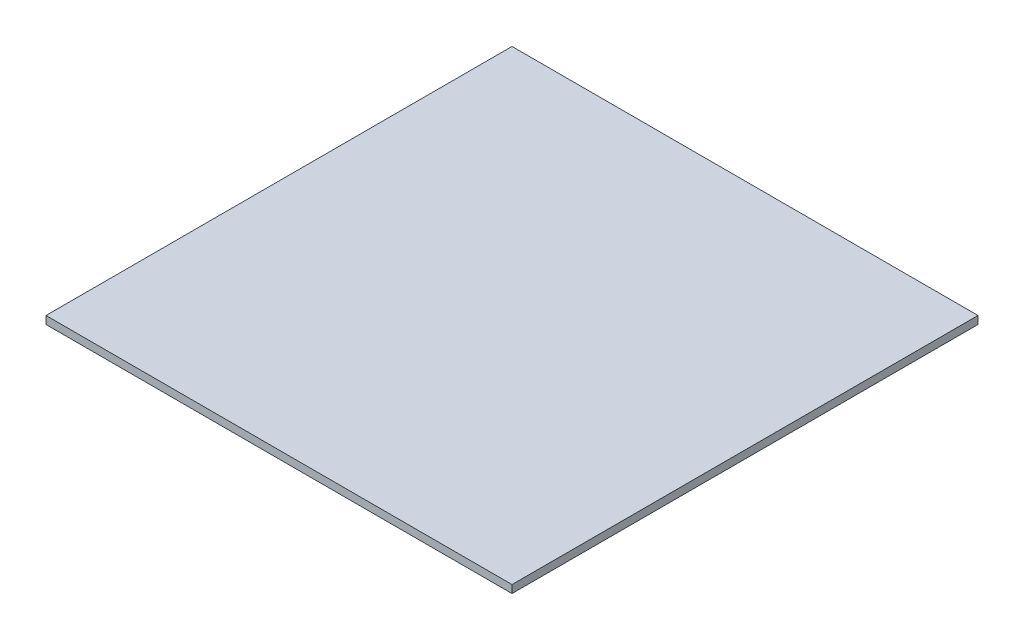
ISO-10303-21;
HEADER;
FILE_DESCRIPTION(('STEP AP214'),'2;1');
FILE_NAME('part.step','',(''),(''),'','','');
FILE_SCHEMA(('AUTOMOTIVE_DESIGN { 1 0 10303 214 1 1 1 1 }'));
ENDSEC;
DATA;
#1=APPLICATION_CONTEXT('core data for automotive mechanical design processes');
#2=APPLICATION_PROTOCOL_DEFINITION('international standard','automotive_design',2000,#1);
#3=PRODUCT_CONTEXT('',#1,'mechanical');
#4=PRODUCT('Part','Part','',(#3));
#5=PRODUCT_RELATED_PRODUCT_CATEGORY('part','',(#4));
#6=PRODUCT_DEFINITION_FORMATION('','',#4);
#7=PRODUCT_DEFINITION_CONTEXT('part definition',#1,'design');
#8=PRODUCT_DEFINITION('design','',#6,#7);
#9=PRODUCT_DEFINITION_SHAPE('','',#8);
#10=(LENGTH_UNIT() NAMED_UNIT(*) SI_UNIT(.MILLI.,.METRE.));
#11=(NAMED_UNIT(*) PLANE_ANGLE_UNIT() SI_UNIT($,.RADIAN.));
#12=(NAMED_UNIT(*) SI_UNIT($,.STERADIAN.) SOLID_ANGLE_UNIT());
#13=UNCERTAINTY_MEASURE_WITH_UNIT(LENGTH_MEASURE(1.E-05),#10,'distance_accuracy_value','');
#14=(GEOMETRIC_REPRESENTATION_CONTEXT(3) GLOBAL_UNCERTAINTY_ASSIGNED_CONTEXT((#13)) GLOBAL_UNIT_ASSIGNED_CONTEXT((#10,
#11,#12)) REPRESENTATION_CONTEXT('',''));
#15=CARTESIAN_POINT('',(0.,0.,0.));
#16=DIRECTION('',(0.,0.,1.));
#17=DIRECTION('',(1.,0.,0.));
#18=AXIS2_PLACEMENT_3D('',#15,#16,#17);
#19=CARTESIAN_POINT('',(297.5,10.,297.5));
#20=DIRECTION('',(-1.,0.,0.));
#21=DIRECTION('',(0.,0.,1.));
#22=AXIS2_PLACEMENT_3D('',#19,#20,#21);
#23=PLANE('',#22);
#24=DIRECTION('',(0.,0.,-1.));
#25=VECTOR('',#24,1.);
#26=CARTESIAN_POINT('',(297.5,0.,297.5));
#27=LINE('',#26,#25);
#28=CARTESIAN_POINT('',(297.5,0.,297.5));
#29=VERTEX_POINT('',#28);
#30=CARTESIAN_POINT('',(297.5,0.,-297.5));
#31=VERTEX_POINT('',#30);
#32=EDGE_CURVE('E96',#29,#31,#27,.T.);
#33=ORIENTED_EDGE('',*,*,#32,.T.);
#34=DIRECTION('',(0.,-1.,0.));
#35=VECTOR('',#34,1.);
#36=CARTESIAN_POINT('',(297.5,10.,-297.5));
#37=LINE('',#36,#35);
#38=CARTESIAN_POINT('',(297.5,10.,-297.5));
#39=VERTEX_POINT('',#38);
#40=EDGE_CURVE('E11',#39,#31,#37,.T.);
#41=ORIENTED_EDGE('',*,*,#40,.F.);
#42=DIRECTION('',(0.,0.,-1.));
#43=VECTOR('',#42,1.);
#44=CARTESIAN_POINT('',(297.5,10.,297.5));
#45=LINE('',#44,#43);
#46=CARTESIAN_POINT('',(297.5,10.,297.5));
#47=VERTEX_POINT('',#46);
#48=EDGE_CURVE('E84',#47,#39,#45,.T.);
#49=ORIENTED_EDGE('',*,*,#48,.F.);
#50=DIRECTION('',(0.,-1.,0.));
#51=VECTOR('',#50,1.);
#52=CARTESIAN_POINT('',(297.5,10.,297.5));
#53=LINE('',#52,#51);
#54=EDGE_CURVE('E92',#47,#29,#53,.T.);
#55=ORIENTED_EDGE('',*,*,#54,.T.);
#56=EDGE_LOOP('',(#33,#41,#49,#55));
#57=FACE_BOUND('',#56,.T.);
#58=ADVANCED_FACE('F33',(#57),#23,.F.);
#59=CARTESIAN_POINT('',(-297.5,10.,-297.5));
#60=DIRECTION('',(0.,0.,1.));
#61=DIRECTION('',(1.,0.,0.));
#62=AXIS2_PLACEMENT_3D('',#59,#60,#61);
#63=PLANE('',#62);
#64=DIRECTION('',(-1.,0.,0.));
#65=VECTOR('',#64,1.);
#66=CARTESIAN_POINT('',(-297.5,0.,-297.5));
#67=LINE('',#66,#65);
#68=CARTESIAN_POINT('',(-297.5,0.,-297.5));
#69=VERTEX_POINT('',#68);
#70=EDGE_CURVE('E88',#31,#69,#67,.T.);
#71=ORIENTED_EDGE('',*,*,#70,.T.);
#72=DIRECTION('',(0.,-1.,0.));
#73=VECTOR('',#72,1.);
#74=CARTESIAN_POINT('',(-297.5,10.,-297.5));
#75=LINE('',#74,#73);
#76=CARTESIAN_POINT('',(-297.5,10.,-297.5));
#77=VERTEX_POINT('',#76);
#78=EDGE_CURVE('E41',#77,#69,#75,.T.);
#79=ORIENTED_EDGE('',*,*,#78,.F.);
#80=DIRECTION('',(-1.,0.,0.));
#81=VECTOR('',#80,1.);
#82=CARTESIAN_POINT('',(-297.5,10.,-297.5));
#83=LINE('',#82,#81);
#84=EDGE_CURVE('E79',#39,#77,#83,.T.);
#85=ORIENTED_EDGE('',*,*,#84,.F.);
#86=ORIENTED_EDGE('',*,*,#40,.T.);
#87=EDGE_LOOP('',(#71,#79,#85,#86));
#88=FACE_BOUND('',#87,.T.);
#89=ADVANCED_FACE('F87',(#88),#63,.F.);
#90=CARTESIAN_POINT('',(-297.5,10.,297.5));
#91=DIRECTION('',(1.,0.,0.));
#92=DIRECTION('',(0.,0.,-1.));
#93=AXIS2_PLACEMENT_3D('',#90,#91,#92);
#94=PLANE('',#93);
#95=DIRECTION('',(0.,0.,1.));
#96=VECTOR('',#95,1.);
#97=CARTESIAN_POINT('',(-297.5,0.,297.5));
#98=LINE('',#97,#96);
#99=CARTESIAN_POINT('',(-297.5,0.,297.5));
#100=VERTEX_POINT('',#99);
#101=EDGE_CURVE('E66',#69,#100,#98,.T.);
#102=ORIENTED_EDGE('',*,*,#101,.T.);
#103=DIRECTION('',(0.,-1.,0.));
#104=VECTOR('',#103,1.);
#105=CARTESIAN_POINT('',(-297.5,10.,297.5));
#106=LINE('',#105,#104);
#107=CARTESIAN_POINT('',(-297.5,10.,297.5));
#108=VERTEX_POINT('',#107);
#109=EDGE_CURVE('E89',#108,#100,#106,.T.);
#110=ORIENTED_EDGE('',*,*,#109,.F.);
#111=DIRECTION('',(0.,0.,1.));
#112=VECTOR('',#111,1.);
#113=CARTESIAN_POINT('',(-297.5,10.,297.5));
#114=LINE('',#113,#112);
#115=EDGE_CURVE('E82',#77,#108,#114,.T.);
#116=ORIENTED_EDGE('',*,*,#115,.F.);
#117=ORIENTED_EDGE('',*,*,#78,.T.);
#118=EDGE_LOOP('',(#102,#110,#116,#117));
#119=FACE_BOUND('',#118,.T.);
#120=ADVANCED_FACE('F90',(#119),#94,.F.);
#121=CARTESIAN_POINT('',(-297.5,10.,297.5));
#122=DIRECTION('',(0.,0.,-1.));
#123=DIRECTION('',(-1.,0.,0.));
#124=AXIS2_PLACEMENT_3D('',#121,#122,#123);
#125=PLANE('',#124);
#126=DIRECTION('',(1.,0.,0.));
#127=VECTOR('',#126,1.);
#128=CARTESIAN_POINT('',(-297.5,0.,297.5));
#129=LINE('',#128,#127);
#130=EDGE_CURVE('E72',#100,#29,#129,.T.);
#131=ORIENTED_EDGE('',*,*,#130,.T.);
#132=ORIENTED_EDGE('',*,*,#54,.F.);
#133=DIRECTION('',(1.,0.,0.));
#134=VECTOR('',#133,1.);
#135=CARTESIAN_POINT('',(-297.5,10.,297.5));
#136=LINE('',#135,#134);
#137=EDGE_CURVE('E49',#108,#47,#136,.T.);
#138=ORIENTED_EDGE('',*,*,#137,.F.);
#139=ORIENTED_EDGE('',*,*,#109,.T.);
#140=EDGE_LOOP('',(#131,#132,#138,#139));
#141=FACE_BOUND('',#140,.T.);
#142=ADVANCED_FACE('F103',(#141),#125,.F.);
#143=CARTESIAN_POINT('',(0.,10.,0.));
#144=DIRECTION('',(0.,-1.,0.));
#145=DIRECTION('',(0.,0.,-1.));
#146=AXIS2_PLACEMENT_3D('',#143,#144,#145);
#147=PLANE('',#146);
#148=ORIENTED_EDGE('',*,*,#48,.T.);
#149=ORIENTED_EDGE('',*,*,#84,.T.);
#150=ORIENTED_EDGE('',*,*,#115,.T.);
#151=ORIENTED_EDGE('',*,*,#137,.T.);
#152=EDGE_LOOP('',(#148,#149,#150,#151));
#153=FACE_BOUND('',#152,.T.);
#154=ADVANCED_FACE('F80',(#153),#147,.F.);
#155=CARTESIAN_POINT('',(0.,0.,0.));
#156=DIRECTION('',(0.,-1.,0.));
#157=DIRECTION('',(0.,0.,-1.));
#158=AXIS2_PLACEMENT_3D('',#155,#156,#157);
#159=PLANE('',#158);
#160=ORIENTED_EDGE('',*,*,#32,.F.);
#161=ORIENTED_EDGE('',*,*,#130,.F.);
#162=ORIENTED_EDGE('',*,*,#101,.F.);
#163=ORIENTED_EDGE('',*,*,#70,.F.);
#164=EDGE_LOOP('',(#160,#161,#162,#163));
#165=FACE_BOUND('',#164,.T.);
#166=ADVANCED_FACE('F106',(#165),#159,.T.);
#167=CLOSED_SHELL('',(#58,#89,#120,#142,#154,#166));
#168=MANIFOLD_SOLID_BREP('B2',#167);
#169=ADVANCED_BREP_SHAPE_REPRESENTATION('',(#18,#168),#14);
#170=SHAPE_DEFINITION_REPRESENTATION(#9,#169);
ENDSEC;
END-ISO-10303-21;
